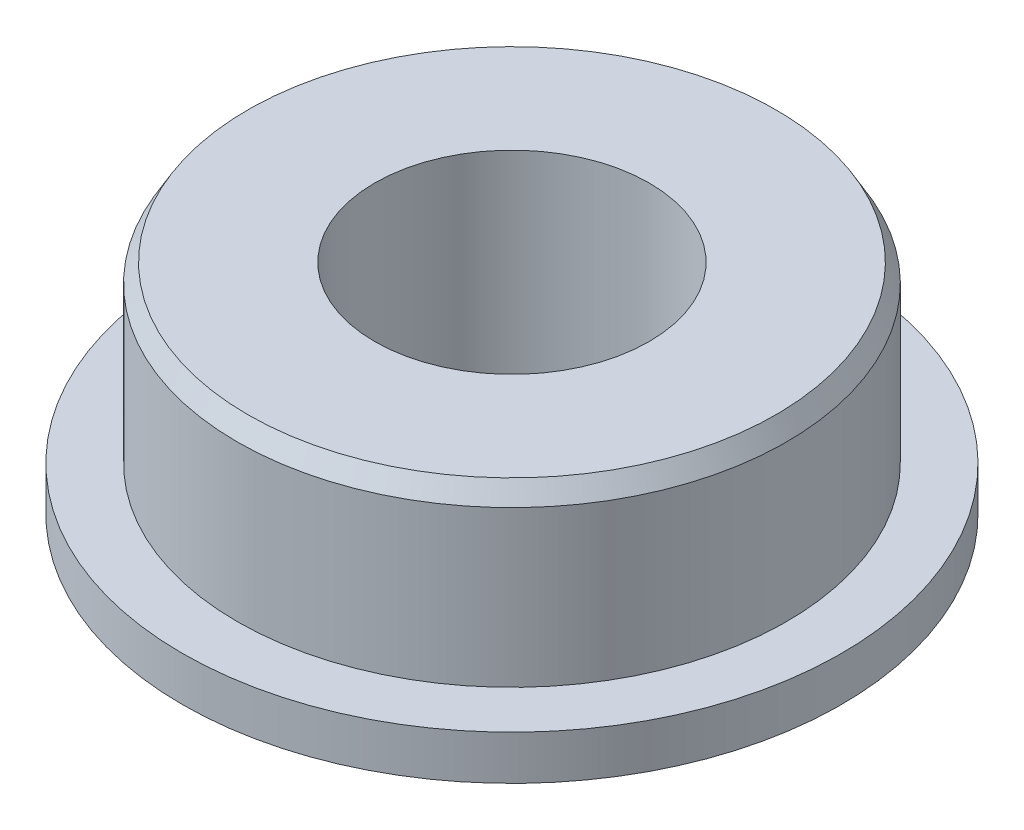
ISO-10303-21;
HEADER;
FILE_DESCRIPTION(('STEP AP214'),'2;1');
FILE_NAME('part.step','',(''),(''),'','','');
FILE_SCHEMA(('AUTOMOTIVE_DESIGN { 1 0 10303 214 1 1 1 1 }'));
ENDSEC;
DATA;
#1=APPLICATION_CONTEXT('core data for automotive mechanical design processes');
#2=APPLICATION_PROTOCOL_DEFINITION('international standard','automotive_design',2000,#1);
#3=PRODUCT_CONTEXT('',#1,'mechanical');
#4=PRODUCT('Part','Part','',(#3));
#5=PRODUCT_RELATED_PRODUCT_CATEGORY('part','',(#4));
#6=PRODUCT_DEFINITION_FORMATION('','',#4);
#7=PRODUCT_DEFINITION_CONTEXT('part definition',#1,'design');
#8=PRODUCT_DEFINITION('design','',#6,#7);
#9=PRODUCT_DEFINITION_SHAPE('','',#8);
#10=(LENGTH_UNIT() NAMED_UNIT(*) SI_UNIT(.MILLI.,.METRE.));
#11=(NAMED_UNIT(*) PLANE_ANGLE_UNIT() SI_UNIT($,.RADIAN.));
#12=(NAMED_UNIT(*) SI_UNIT($,.STERADIAN.) SOLID_ANGLE_UNIT());
#13=UNCERTAINTY_MEASURE_WITH_UNIT(LENGTH_MEASURE(1.E-05),#10,'distance_accuracy_value','');
#14=(GEOMETRIC_REPRESENTATION_CONTEXT(3) GLOBAL_UNCERTAINTY_ASSIGNED_CONTEXT((#13)) GLOBAL_UNIT_ASSIGNED_CONTEXT((#10,
#11,#12)) REPRESENTATION_CONTEXT('',''));
#15=CARTESIAN_POINT('',(0.,0.,0.));
#16=DIRECTION('',(0.,0.,1.));
#17=DIRECTION('',(1.,0.,0.));
#18=AXIS2_PLACEMENT_3D('',#15,#16,#17);
#19=CARTESIAN_POINT('',(0.,2.5,0.));
#20=DIRECTION('',(0.,-1.,0.));
#21=DIRECTION('',(0.,0.,-1.));
#22=AXIS2_PLACEMENT_3D('',#19,#20,#21);
#23=CYLINDRICAL_SURFACE('',#22,1.5);
#24=CARTESIAN_POINT('',(0.,2.5,0.));
#25=DIRECTION('',(0.,1.,0.));
#26=DIRECTION('',(0.,0.,1.));
#27=AXIS2_PLACEMENT_3D('',#24,#25,#26);
#28=CIRCLE('',#27,1.5);
#29=CARTESIAN_POINT('',(0.,2.5,1.5));
#30=VERTEX_POINT('',#29);
#31=EDGE_CURVE('E56',#30,#30,#28,.T.);
#32=ORIENTED_EDGE('',*,*,#31,.T.);
#33=EDGE_LOOP('',(#32));
#34=FACE_BOUND('',#33,.T.);
#35=CARTESIAN_POINT('',(0.,0.,0.));
#36=DIRECTION('',(0.,1.,0.));
#37=DIRECTION('',(0.,0.,1.));
#38=AXIS2_PLACEMENT_3D('',#35,#36,#37);
#39=CIRCLE('',#38,1.5);
#40=CARTESIAN_POINT('',(0.,0.,1.5));
#41=VERTEX_POINT('',#40);
#42=EDGE_CURVE('E57',#41,#41,#39,.T.);
#43=ORIENTED_EDGE('',*,*,#42,.F.);
#44=EDGE_LOOP('',(#43));
#45=FACE_BOUND('',#44,.T.);
#46=ADVANCED_FACE('F36',(#34,#45),#23,.F.);
#47=CARTESIAN_POINT('',(0.,2.5,0.));
#48=DIRECTION('',(0.,-1.,0.));
#49=DIRECTION('',(0.,0.,-1.));
#50=AXIS2_PLACEMENT_3D('',#47,#48,#49);
#51=CYLINDRICAL_SURFACE('',#50,3.);
#52=CARTESIAN_POINT('',(0.,2.3,0.));
#53=DIRECTION('',(0.,1.,0.));
#54=DIRECTION('',(0.,0.,1.));
#55=AXIS2_PLACEMENT_3D('',#52,#53,#54);
#56=CIRCLE('',#55,3.);
#57=CARTESIAN_POINT('',(0.,2.3,3.));
#58=VERTEX_POINT('',#57);
#59=EDGE_CURVE('E10',#58,#58,#56,.F.);
#60=ORIENTED_EDGE('',*,*,#59,.T.);
#61=EDGE_LOOP('',(#60));
#62=FACE_BOUND('',#61,.T.);
#63=CARTESIAN_POINT('',(0.,0.6,0.));
#64=DIRECTION('',(0.,1.,0.));
#65=DIRECTION('',(0.,0.,1.));
#66=AXIS2_PLACEMENT_3D('',#63,#64,#65);
#67=CIRCLE('',#66,3.);
#68=CARTESIAN_POINT('',(0.,0.6,3.));
#69=VERTEX_POINT('',#68);
#70=EDGE_CURVE('E65',#69,#69,#67,.T.);
#71=ORIENTED_EDGE('',*,*,#70,.T.);
#72=EDGE_LOOP('',(#71));
#73=FACE_BOUND('',#72,.T.);
#74=ADVANCED_FACE('F69',(#62,#73),#51,.T.);
#75=CARTESIAN_POINT('',(0.,2.5,0.));
#76=DIRECTION('',(0.,1.,0.));
#77=DIRECTION('',(0.,0.,1.));
#78=AXIS2_PLACEMENT_3D('',#75,#76,#77);
#79=PLANE('',#78);
#80=CARTESIAN_POINT('',(0.,2.5,0.));
#81=DIRECTION('',(0.,1.,0.));
#82=DIRECTION('',(0.,0.,1.));
#83=AXIS2_PLACEMENT_3D('',#80,#81,#82);
#84=CIRCLE('',#83,2.88452994616208);
#85=CARTESIAN_POINT('',(0.,2.5,2.88452994616208));
#86=VERTEX_POINT('',#85);
#87=EDGE_CURVE('E43',#86,#86,#84,.T.);
#88=ORIENTED_EDGE('',*,*,#87,.T.);
#89=EDGE_LOOP('',(#88));
#90=FACE_BOUND('',#89,.T.);
#91=ORIENTED_EDGE('',*,*,#31,.F.);
#92=EDGE_LOOP('',(#91));
#93=FACE_BOUND('',#92,.T.);
#94=ADVANCED_FACE('F86',(#90,#93),#79,.T.);
#95=CARTESIAN_POINT('',(0.,0.,0.));
#96=DIRECTION('',(0.,1.,0.));
#97=DIRECTION('',(0.,0.,1.));
#98=AXIS2_PLACEMENT_3D('',#95,#96,#97);
#99=PLANE('',#98);
#100=CARTESIAN_POINT('',(0.,0.,0.));
#101=DIRECTION('',(0.,1.,0.));
#102=DIRECTION('',(0.,0.,1.));
#103=AXIS2_PLACEMENT_3D('',#100,#101,#102);
#104=CIRCLE('',#103,3.4);
#105=CARTESIAN_POINT('',(0.,0.,3.4));
#106=VERTEX_POINT('',#105);
#107=EDGE_CURVE('E47',#106,#106,#104,.F.);
#108=ORIENTED_EDGE('',*,*,#107,.T.);
#109=EDGE_LOOP('',(#108));
#110=FACE_BOUND('',#109,.T.);
#111=ORIENTED_EDGE('',*,*,#42,.T.);
#112=EDGE_LOOP('',(#111));
#113=FACE_BOUND('',#112,.T.);
#114=ADVANCED_FACE('F80',(#110,#113),#99,.F.);
#115=CARTESIAN_POINT('',(0.,0.6,0.));
#116=DIRECTION('',(0.,-1.,0.));
#117=DIRECTION('',(0.,0.,-1.));
#118=AXIS2_PLACEMENT_3D('',#115,#116,#117);
#119=CYLINDRICAL_SURFACE('',#118,3.6);
#120=CARTESIAN_POINT('',(0.,0.115470053837926,0.));
#121=DIRECTION('',(0.,1.,0.));
#122=DIRECTION('',(0.,0.,1.));
#123=AXIS2_PLACEMENT_3D('',#120,#121,#122);
#124=CIRCLE('',#123,3.6);
#125=CARTESIAN_POINT('',(0.,0.115470053837926,3.6));
#126=VERTEX_POINT('',#125);
#127=EDGE_CURVE('E51',#126,#126,#124,.T.);
#128=ORIENTED_EDGE('',*,*,#127,.T.);
#129=EDGE_LOOP('',(#128));
#130=FACE_BOUND('',#129,.T.);
#131=CARTESIAN_POINT('',(0.,0.6,0.));
#132=DIRECTION('',(0.,1.,0.));
#133=DIRECTION('',(0.,0.,1.));
#134=AXIS2_PLACEMENT_3D('',#131,#132,#133);
#135=CIRCLE('',#134,3.6);
#136=CARTESIAN_POINT('',(0.,0.6,3.6));
#137=VERTEX_POINT('',#136);
#138=EDGE_CURVE('E60',#137,#137,#135,.T.);
#139=ORIENTED_EDGE('',*,*,#138,.F.);
#140=EDGE_LOOP('',(#139));
#141=FACE_BOUND('',#140,.T.);
#142=ADVANCED_FACE('F75',(#130,#141),#119,.T.);
#143=CARTESIAN_POINT('',(0.,0.6,0.));
#144=DIRECTION('',(0.,1.,0.));
#145=DIRECTION('',(0.,0.,1.));
#146=AXIS2_PLACEMENT_3D('',#143,#144,#145);
#147=PLANE('',#146);
#148=ORIENTED_EDGE('',*,*,#70,.F.);
#149=EDGE_LOOP('',(#148));
#150=FACE_BOUND('',#149,.T.);
#151=ORIENTED_EDGE('',*,*,#138,.T.);
#152=EDGE_LOOP('',(#151));
#153=FACE_BOUND('',#152,.T.);
#154=ADVANCED_FACE('F71',(#150,#153),#147,.T.);
#155=CARTESIAN_POINT('',(0.,0.115470053837926,0.));
#156=DIRECTION('',(0.,1.,0.));
#157=DIRECTION('',(0.,0.,1.));
#158=AXIS2_PLACEMENT_3D('',#155,#156,#157);
#159=CONICAL_SURFACE('',#158,3.6,1.0471975511966);
#160=ORIENTED_EDGE('',*,*,#107,.F.);
#161=EDGE_LOOP('',(#160));
#162=FACE_BOUND('',#161,.T.);
#163=ORIENTED_EDGE('',*,*,#127,.F.);
#164=EDGE_LOOP('',(#163));
#165=FACE_BOUND('',#164,.T.);
#166=ADVANCED_FACE('F74',(#162,#165),#159,.T.);
#167=CARTESIAN_POINT('',(0.,2.5,0.));
#168=DIRECTION('',(0.,-1.,0.));
#169=DIRECTION('',(0.,0.,-1.));
#170=AXIS2_PLACEMENT_3D('',#167,#168,#169);
#171=CONICAL_SURFACE('',#170,2.88452994616208,0.523598775598292);
#172=ORIENTED_EDGE('',*,*,#59,.F.);
#173=EDGE_LOOP('',(#172));
#174=FACE_BOUND('',#173,.T.);
#175=ORIENTED_EDGE('',*,*,#87,.F.);
#176=EDGE_LOOP('',(#175));
#177=FACE_BOUND('',#176,.T.);
#178=ADVANCED_FACE('F38',(#174,#177),#171,.T.);
#179=CLOSED_SHELL('',(#46,#74,#94,#114,#142,#154,#166,#178));
#180=MANIFOLD_SOLID_BREP('B2',#179);
#181=ADVANCED_BREP_SHAPE_REPRESENTATION('',(#18,#180),#14);
#182=SHAPE_DEFINITION_REPRESENTATION(#9,#181);
ENDSEC;
END-ISO-10303-21;
